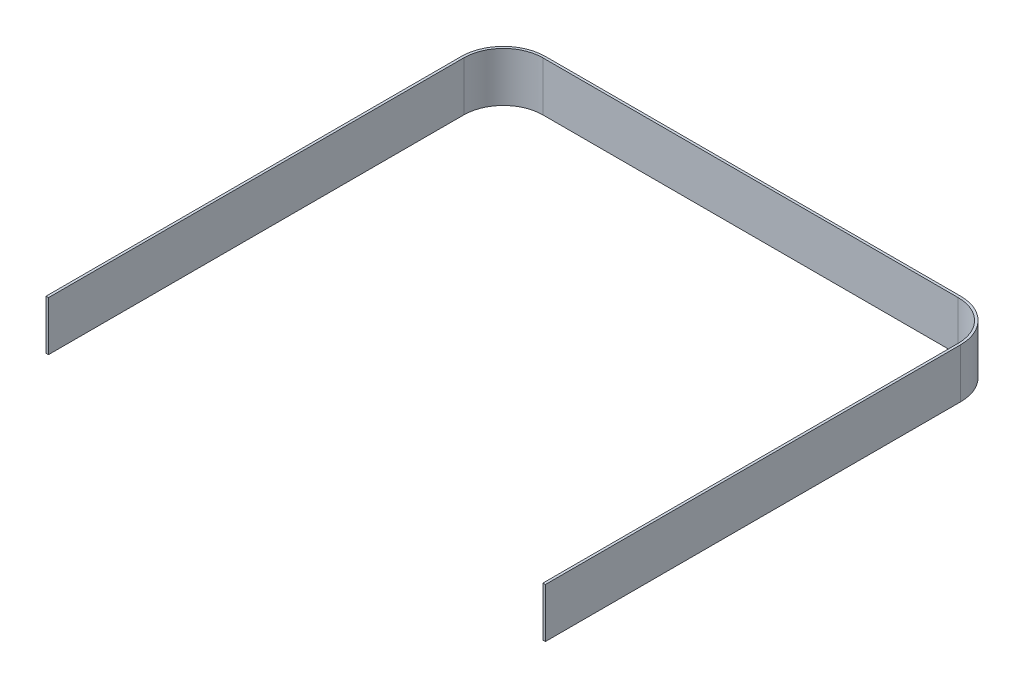
ISO-10303-21;
HEADER;
FILE_DESCRIPTION(('STEP AP214'),'2;1');
FILE_NAME('part.step','',(''),(''),'','','');
FILE_SCHEMA(('AUTOMOTIVE_DESIGN { 1 0 10303 214 1 1 1 1 }'));
ENDSEC;
DATA;
#1=APPLICATION_CONTEXT('core data for automotive mechanical design processes');
#2=APPLICATION_PROTOCOL_DEFINITION('international standard','automotive_design',2000,#1);
#3=PRODUCT_CONTEXT('',#1,'mechanical');
#4=PRODUCT('Part','Part','',(#3));
#5=PRODUCT_RELATED_PRODUCT_CATEGORY('part','',(#4));
#6=PRODUCT_DEFINITION_FORMATION('','',#4);
#7=PRODUCT_DEFINITION_CONTEXT('part definition',#1,'design');
#8=PRODUCT_DEFINITION('design','',#6,#7);
#9=PRODUCT_DEFINITION_SHAPE('','',#8);
#10=(LENGTH_UNIT() NAMED_UNIT(*) SI_UNIT(.MILLI.,.METRE.));
#11=(NAMED_UNIT(*) PLANE_ANGLE_UNIT() SI_UNIT($,.RADIAN.));
#12=(NAMED_UNIT(*) SI_UNIT($,.STERADIAN.) SOLID_ANGLE_UNIT());
#13=UNCERTAINTY_MEASURE_WITH_UNIT(LENGTH_MEASURE(1.E-05),#10,'distance_accuracy_value','');
#14=(GEOMETRIC_REPRESENTATION_CONTEXT(3) GLOBAL_UNCERTAINTY_ASSIGNED_CONTEXT((#13)) GLOBAL_UNIT_ASSIGNED_CONTEXT((#10,
#11,#12)) REPRESENTATION_CONTEXT('',''));
#15=CARTESIAN_POINT('',(0.,0.,0.));
#16=DIRECTION('',(0.,0.,1.));
#17=DIRECTION('',(1.,0.,0.));
#18=AXIS2_PLACEMENT_3D('',#15,#16,#17);
#19=CARTESIAN_POINT('',(-3.175,63.5,50.8));
#20=DIRECTION('',(1.,0.,0.));
#21=DIRECTION('',(0.,0.,-1.));
#22=AXIS2_PLACEMENT_3D('',#19,#20,#21);
#23=PLANE('',#22);
#24=DIRECTION('',(0.,0.,-1.));
#25=VECTOR('',#24,1.);
#26=CARTESIAN_POINT('',(-3.175,0.,50.8));
#27=LINE('',#26,#25);
#28=CARTESIAN_POINT('',(-3.175,0.,50.8));
#29=VERTEX_POINT('',#28);
#30=CARTESIAN_POINT('',(-3.175,0.,584.2));
#31=VERTEX_POINT('',#30);
#32=EDGE_CURVE('E153',#29,#31,#27,.F.);
#33=ORIENTED_EDGE('',*,*,#32,.T.);
#34=DIRECTION('',(0.,-1.,0.));
#35=VECTOR('',#34,1.);
#36=CARTESIAN_POINT('',(-3.175,63.5,584.2));
#37=LINE('',#36,#35);
#38=CARTESIAN_POINT('',(-3.175,63.5,584.2));
#39=VERTEX_POINT('',#38);
#40=EDGE_CURVE('E11',#39,#31,#37,.T.);
#41=ORIENTED_EDGE('',*,*,#40,.F.);
#42=DIRECTION('',(0.,0.,-1.));
#43=VECTOR('',#42,1.);
#44=CARTESIAN_POINT('',(-3.175,63.5,50.8));
#45=LINE('',#44,#43);
#46=CARTESIAN_POINT('',(-3.175,63.5,50.8));
#47=VERTEX_POINT('',#46);
#48=EDGE_CURVE('E101',#47,#39,#45,.F.);
#49=ORIENTED_EDGE('',*,*,#48,.F.);
#50=DIRECTION('',(0.,-1.,0.));
#51=VECTOR('',#50,1.);
#52=CARTESIAN_POINT('',(-3.175,63.5,50.8));
#53=LINE('',#52,#51);
#54=EDGE_CURVE('E149',#47,#29,#53,.T.);
#55=ORIENTED_EDGE('',*,*,#54,.T.);
#56=EDGE_LOOP('',(#33,#41,#49,#55));
#57=FACE_BOUND('',#56,.T.);
#58=ADVANCED_FACE('F33',(#57),#23,.F.);
#59=CARTESIAN_POINT('',(0.,63.5,584.2));
#60=DIRECTION('',(0.,0.,1.));
#61=DIRECTION('',(1.,0.,0.));
#62=AXIS2_PLACEMENT_3D('',#59,#60,#61);
#63=PLANE('',#62);
#64=DIRECTION('',(-1.,0.,0.));
#65=VECTOR('',#64,1.);
#66=CARTESIAN_POINT('',(0.,0.,584.2));
#67=LINE('',#66,#65);
#68=CARTESIAN_POINT('',(0.,0.,584.2));
#69=VERTEX_POINT('',#68);
#70=EDGE_CURVE('E156',#69,#31,#67,.T.);
#71=ORIENTED_EDGE('',*,*,#70,.F.);
#72=DIRECTION('',(0.,-1.,0.));
#73=VECTOR('',#72,1.);
#74=CARTESIAN_POINT('',(0.,63.5,584.2));
#75=LINE('',#74,#73);
#76=CARTESIAN_POINT('',(0.,63.5,584.2));
#77=VERTEX_POINT('',#76);
#78=EDGE_CURVE('E41',#77,#69,#75,.T.);
#79=ORIENTED_EDGE('',*,*,#78,.F.);
#80=DIRECTION('',(-1.,0.,0.));
#81=VECTOR('',#80,1.);
#82=CARTESIAN_POINT('',(0.,63.5,584.2));
#83=LINE('',#82,#81);
#84=EDGE_CURVE('E218',#77,#39,#83,.T.);
#85=ORIENTED_EDGE('',*,*,#84,.T.);
#86=ORIENTED_EDGE('',*,*,#40,.T.);
#87=EDGE_LOOP('',(#71,#79,#85,#86));
#88=FACE_BOUND('',#87,.T.);
#89=ADVANCED_FACE('F205',(#88),#63,.T.);
#90=CARTESIAN_POINT('',(0.,63.5,50.8));
#91=DIRECTION('',(1.,0.,0.));
#92=DIRECTION('',(0.,0.,-1.));
#93=AXIS2_PLACEMENT_3D('',#90,#91,#92);
#94=PLANE('',#93);
#95=DIRECTION('',(0.,0.,1.));
#96=VECTOR('',#95,1.);
#97=CARTESIAN_POINT('',(0.,0.,50.8));
#98=LINE('',#97,#96);
#99=CARTESIAN_POINT('',(0.,0.,50.8));
#100=VERTEX_POINT('',#99);
#101=EDGE_CURVE('E159',#100,#69,#98,.T.);
#102=ORIENTED_EDGE('',*,*,#101,.F.);
#103=DIRECTION('',(0.,-1.,0.));
#104=VECTOR('',#103,1.);
#105=CARTESIAN_POINT('',(0.,63.5,50.8));
#106=LINE('',#105,#104);
#107=CARTESIAN_POINT('',(0.,63.5,50.8));
#108=VERTEX_POINT('',#107);
#109=EDGE_CURVE('E195',#108,#100,#106,.T.);
#110=ORIENTED_EDGE('',*,*,#109,.F.);
#111=DIRECTION('',(0.,0.,1.));
#112=VECTOR('',#111,1.);
#113=CARTESIAN_POINT('',(0.,63.5,50.8));
#114=LINE('',#113,#112);
#115=EDGE_CURVE('E202',#108,#77,#114,.T.);
#116=ORIENTED_EDGE('',*,*,#115,.T.);
#117=ORIENTED_EDGE('',*,*,#78,.T.);
#118=EDGE_LOOP('',(#102,#110,#116,#117));
#119=FACE_BOUND('',#118,.T.);
#120=ADVANCED_FACE('F200',(#119),#94,.T.);
#121=CARTESIAN_POINT('',(50.8,63.5,50.8));
#122=DIRECTION('',(0.,-1.,0.));
#123=DIRECTION('',(0.,0.,-1.));
#124=AXIS2_PLACEMENT_3D('',#121,#122,#123);
#125=CYLINDRICAL_SURFACE('',#124,50.8);
#126=CARTESIAN_POINT('',(50.8,0.,50.8));
#127=DIRECTION('',(0.,1.,0.));
#128=DIRECTION('',(0.,0.,1.));
#129=AXIS2_PLACEMENT_3D('',#126,#127,#128);
#130=CIRCLE('',#129,50.8);
#131=CARTESIAN_POINT('',(50.8,0.,0.));
#132=VERTEX_POINT('',#131);
#133=EDGE_CURVE('E162',#132,#100,#130,.T.);
#134=ORIENTED_EDGE('',*,*,#133,.F.);
#135=DIRECTION('',(0.,-1.,0.));
#136=VECTOR('',#135,1.);
#137=CARTESIAN_POINT('',(50.8,63.5,0.));
#138=LINE('',#137,#136);
#139=CARTESIAN_POINT('',(50.8,63.5,0.));
#140=VERTEX_POINT('',#139);
#141=EDGE_CURVE('E193',#140,#132,#138,.T.);
#142=ORIENTED_EDGE('',*,*,#141,.F.);
#143=CARTESIAN_POINT('',(50.8,63.5,50.8));
#144=DIRECTION('',(0.,1.,0.));
#145=DIRECTION('',(0.,0.,1.));
#146=AXIS2_PLACEMENT_3D('',#143,#144,#145);
#147=CIRCLE('',#146,50.8);
#148=EDGE_CURVE('E215',#140,#108,#147,.T.);
#149=ORIENTED_EDGE('',*,*,#148,.T.);
#150=ORIENTED_EDGE('',*,*,#109,.T.);
#151=EDGE_LOOP('',(#134,#142,#149,#150));
#152=FACE_BOUND('',#151,.T.);
#153=ADVANCED_FACE('F212',(#152),#125,.F.);
#154=CARTESIAN_POINT('',(50.8,63.5,0.));
#155=DIRECTION('',(0.,0.,1.));
#156=DIRECTION('',(1.,0.,0.));
#157=AXIS2_PLACEMENT_3D('',#154,#155,#156);
#158=PLANE('',#157);
#159=DIRECTION('',(-1.,0.,0.));
#160=VECTOR('',#159,1.);
#161=CARTESIAN_POINT('',(50.8,0.,0.));
#162=LINE('',#161,#160);
#163=CARTESIAN_POINT('',(584.2,0.,0.));
#164=VERTEX_POINT('',#163);
#165=EDGE_CURVE('E165',#164,#132,#162,.T.);
#166=ORIENTED_EDGE('',*,*,#165,.F.);
#167=DIRECTION('',(0.,-1.,0.));
#168=VECTOR('',#167,1.);
#169=CARTESIAN_POINT('',(584.2,63.5,0.));
#170=LINE('',#169,#168);
#171=CARTESIAN_POINT('',(584.2,63.5,0.));
#172=VERTEX_POINT('',#171);
#173=EDGE_CURVE('E191',#172,#164,#170,.T.);
#174=ORIENTED_EDGE('',*,*,#173,.F.);
#175=DIRECTION('',(-1.,0.,0.));
#176=VECTOR('',#175,1.);
#177=CARTESIAN_POINT('',(50.8,63.5,0.));
#178=LINE('',#177,#176);
#179=EDGE_CURVE('E220',#172,#140,#178,.T.);
#180=ORIENTED_EDGE('',*,*,#179,.T.);
#181=ORIENTED_EDGE('',*,*,#141,.T.);
#182=EDGE_LOOP('',(#166,#174,#180,#181));
#183=FACE_BOUND('',#182,.T.);
#184=ADVANCED_FACE('F320',(#183),#158,.T.);
#185=CARTESIAN_POINT('',(584.2,63.5,50.8));
#186=DIRECTION('',(0.,-1.,0.));
#187=DIRECTION('',(0.,0.,-1.));
#188=AXIS2_PLACEMENT_3D('',#185,#186,#187);
#189=CYLINDRICAL_SURFACE('',#188,50.8);
#190=CARTESIAN_POINT('',(584.2,0.,50.8));
#191=DIRECTION('',(0.,1.,0.));
#192=DIRECTION('',(0.,0.,-1.));
#193=AXIS2_PLACEMENT_3D('',#190,#191,#192);
#194=CIRCLE('',#193,50.8);
#195=CARTESIAN_POINT('',(635.,0.,50.8));
#196=VERTEX_POINT('',#195);
#197=EDGE_CURVE('E168',#196,#164,#194,.T.);
#198=ORIENTED_EDGE('',*,*,#197,.F.);
#199=DIRECTION('',(0.,-1.,0.));
#200=VECTOR('',#199,1.);
#201=CARTESIAN_POINT('',(635.,63.5,50.8));
#202=LINE('',#201,#200);
#203=CARTESIAN_POINT('',(635.,63.5,50.8));
#204=VERTEX_POINT('',#203);
#205=EDGE_CURVE('E189',#204,#196,#202,.T.);
#206=ORIENTED_EDGE('',*,*,#205,.F.);
#207=CARTESIAN_POINT('',(584.2,63.5,50.8));
#208=DIRECTION('',(0.,1.,0.));
#209=DIRECTION('',(0.,0.,-1.));
#210=AXIS2_PLACEMENT_3D('',#207,#208,#209);
#211=CIRCLE('',#210,50.8);
#212=EDGE_CURVE('E226',#204,#172,#211,.T.);
#213=ORIENTED_EDGE('',*,*,#212,.T.);
#214=ORIENTED_EDGE('',*,*,#173,.T.);
#215=EDGE_LOOP('',(#198,#206,#213,#214));
#216=FACE_BOUND('',#215,.T.);
#217=ADVANCED_FACE('F311',(#216),#189,.F.);
#218=CARTESIAN_POINT('',(635.,63.5,50.8));
#219=DIRECTION('',(-1.,0.,0.));
#220=DIRECTION('',(0.,0.,1.));
#221=AXIS2_PLACEMENT_3D('',#218,#219,#220);
#222=PLANE('',#221);
#223=DIRECTION('',(0.,0.,-1.));
#224=VECTOR('',#223,1.);
#225=CARTESIAN_POINT('',(635.,0.,50.8));
#226=LINE('',#225,#224);
#227=CARTESIAN_POINT('',(635.,0.,584.2));
#228=VERTEX_POINT('',#227);
#229=EDGE_CURVE('E171',#228,#196,#226,.T.);
#230=ORIENTED_EDGE('',*,*,#229,.F.);
#231=DIRECTION('',(0.,-1.,0.));
#232=VECTOR('',#231,1.);
#233=CARTESIAN_POINT('',(635.,63.5,584.2));
#234=LINE('',#233,#232);
#235=CARTESIAN_POINT('',(635.,63.5,584.2));
#236=VERTEX_POINT('',#235);
#237=EDGE_CURVE('E187',#236,#228,#234,.T.);
#238=ORIENTED_EDGE('',*,*,#237,.F.);
#239=DIRECTION('',(0.,0.,-1.));
#240=VECTOR('',#239,1.);
#241=CARTESIAN_POINT('',(635.,63.5,50.8));
#242=LINE('',#241,#240);
#243=EDGE_CURVE('E229',#236,#204,#242,.T.);
#244=ORIENTED_EDGE('',*,*,#243,.T.);
#245=ORIENTED_EDGE('',*,*,#205,.T.);
#246=EDGE_LOOP('',(#230,#238,#244,#245));
#247=FACE_BOUND('',#246,.T.);
#248=ADVANCED_FACE('F241',(#247),#222,.T.);
#249=CARTESIAN_POINT('',(638.175,63.5,584.2));
#250=DIRECTION('',(0.,0.,1.));
#251=DIRECTION('',(1.,0.,0.));
#252=AXIS2_PLACEMENT_3D('',#249,#250,#251);
#253=PLANE('',#252);
#254=DIRECTION('',(-1.,0.,0.));
#255=VECTOR('',#254,1.);
#256=CARTESIAN_POINT('',(638.175,0.,584.2));
#257=LINE('',#256,#255);
#258=CARTESIAN_POINT('',(638.175,0.,584.2));
#259=VERTEX_POINT('',#258);
#260=EDGE_CURVE('E174',#259,#228,#257,.T.);
#261=ORIENTED_EDGE('',*,*,#260,.F.);
#262=DIRECTION('',(0.,-1.,0.));
#263=VECTOR('',#262,1.);
#264=CARTESIAN_POINT('',(638.175,63.5,584.2));
#265=LINE('',#264,#263);
#266=CARTESIAN_POINT('',(638.175,63.5,584.2));
#267=VERTEX_POINT('',#266);
#268=EDGE_CURVE('E185',#267,#259,#265,.T.);
#269=ORIENTED_EDGE('',*,*,#268,.F.);
#270=DIRECTION('',(-1.,0.,0.));
#271=VECTOR('',#270,1.);
#272=CARTESIAN_POINT('',(638.175,63.5,584.2));
#273=LINE('',#272,#271);
#274=EDGE_CURVE('E232',#267,#236,#273,.T.);
#275=ORIENTED_EDGE('',*,*,#274,.T.);
#276=ORIENTED_EDGE('',*,*,#237,.T.);
#277=EDGE_LOOP('',(#261,#269,#275,#276));
#278=FACE_BOUND('',#277,.T.);
#279=ADVANCED_FACE('F236',(#278),#253,.T.);
#280=CARTESIAN_POINT('',(638.175,63.5,50.8));
#281=DIRECTION('',(-1.,0.,0.));
#282=DIRECTION('',(0.,0.,1.));
#283=AXIS2_PLACEMENT_3D('',#280,#281,#282);
#284=PLANE('',#283);
#285=DIRECTION('',(0.,0.,-1.));
#286=VECTOR('',#285,1.);
#287=CARTESIAN_POINT('',(638.175,0.,50.8));
#288=LINE('',#287,#286);
#289=CARTESIAN_POINT('',(638.175,0.,50.8));
#290=VERTEX_POINT('',#289);
#291=EDGE_CURVE('E177',#259,#290,#288,.T.);
#292=ORIENTED_EDGE('',*,*,#291,.T.);
#293=DIRECTION('',(0.,-1.,0.));
#294=VECTOR('',#293,1.);
#295=CARTESIAN_POINT('',(638.175,63.5,50.8));
#296=LINE('',#295,#294);
#297=CARTESIAN_POINT('',(638.175,63.5,50.8));
#298=VERTEX_POINT('',#297);
#299=EDGE_CURVE('E144',#298,#290,#296,.T.);
#300=ORIENTED_EDGE('',*,*,#299,.F.);
#301=DIRECTION('',(0.,0.,-1.));
#302=VECTOR('',#301,1.);
#303=CARTESIAN_POINT('',(638.175,63.5,50.8));
#304=LINE('',#303,#302);
#305=EDGE_CURVE('E135',#267,#298,#304,.T.);
#306=ORIENTED_EDGE('',*,*,#305,.F.);
#307=ORIENTED_EDGE('',*,*,#268,.T.);
#308=EDGE_LOOP('',(#292,#300,#306,#307));
#309=FACE_BOUND('',#308,.T.);
#310=ADVANCED_FACE('F245',(#309),#284,.F.);
#311=CARTESIAN_POINT('',(584.2,63.5,50.8));
#312=DIRECTION('',(0.,-1.,0.));
#313=DIRECTION('',(0.,0.,-1.));
#314=AXIS2_PLACEMENT_3D('',#311,#312,#313);
#315=CYLINDRICAL_SURFACE('',#314,53.975);
#316=CARTESIAN_POINT('',(584.2,0.,50.8));
#317=DIRECTION('',(0.,1.,0.));
#318=DIRECTION('',(1.,0.,0.));
#319=AXIS2_PLACEMENT_3D('',#316,#317,#318);
#320=CIRCLE('',#319,53.975);
#321=CARTESIAN_POINT('',(584.2,0.,-3.175));
#322=VERTEX_POINT('',#321);
#323=EDGE_CURVE('E143',#290,#322,#320,.T.);
#324=ORIENTED_EDGE('',*,*,#323,.T.);
#325=DIRECTION('',(0.,-1.,0.));
#326=VECTOR('',#325,1.);
#327=CARTESIAN_POINT('',(584.2,63.5,-3.175));
#328=LINE('',#327,#326);
#329=CARTESIAN_POINT('',(584.2,63.5,-3.175));
#330=VERTEX_POINT('',#329);
#331=EDGE_CURVE('E140',#330,#322,#328,.T.);
#332=ORIENTED_EDGE('',*,*,#331,.F.);
#333=CARTESIAN_POINT('',(584.2,63.5,50.8));
#334=DIRECTION('',(0.,1.,0.));
#335=DIRECTION('',(1.,0.,0.));
#336=AXIS2_PLACEMENT_3D('',#333,#334,#335);
#337=CIRCLE('',#336,53.975);
#338=EDGE_CURVE('E128',#298,#330,#337,.T.);
#339=ORIENTED_EDGE('',*,*,#338,.F.);
#340=ORIENTED_EDGE('',*,*,#299,.T.);
#341=EDGE_LOOP('',(#324,#332,#339,#340));
#342=FACE_BOUND('',#341,.T.);
#343=ADVANCED_FACE('F141',(#342),#315,.T.);
#344=CARTESIAN_POINT('',(50.8,63.5,-3.175));
#345=DIRECTION('',(0.,0.,1.));
#346=DIRECTION('',(1.,0.,0.));
#347=AXIS2_PLACEMENT_3D('',#344,#345,#346);
#348=PLANE('',#347);
#349=DIRECTION('',(1.,0.,0.));
#350=VECTOR('',#349,1.);
#351=CARTESIAN_POINT('',(50.8,0.,-3.175));
#352=LINE('',#351,#350);
#353=CARTESIAN_POINT('',(50.8,0.,-3.17499999999999));
#354=VERTEX_POINT('',#353);
#355=EDGE_CURVE('E89',#322,#354,#352,.F.);
#356=ORIENTED_EDGE('',*,*,#355,.T.);
#357=DIRECTION('',(0.,-1.,0.));
#358=VECTOR('',#357,1.);
#359=CARTESIAN_POINT('',(50.8,63.5,-3.17499999999999));
#360=LINE('',#359,#358);
#361=CARTESIAN_POINT('',(50.8,63.5,-3.17499999999999));
#362=VERTEX_POINT('',#361);
#363=EDGE_CURVE('E145',#362,#354,#360,.T.);
#364=ORIENTED_EDGE('',*,*,#363,.F.);
#365=DIRECTION('',(1.,0.,0.));
#366=VECTOR('',#365,1.);
#367=CARTESIAN_POINT('',(50.8,63.5,-3.175));
#368=LINE('',#367,#366);
#369=EDGE_CURVE('E132',#330,#362,#368,.F.);
#370=ORIENTED_EDGE('',*,*,#369,.F.);
#371=ORIENTED_EDGE('',*,*,#331,.T.);
#372=EDGE_LOOP('',(#356,#364,#370,#371));
#373=FACE_BOUND('',#372,.T.);
#374=ADVANCED_FACE('F147',(#373),#348,.F.);
#375=CARTESIAN_POINT('',(50.8,63.5,50.8));
#376=DIRECTION('',(0.,-1.,0.));
#377=DIRECTION('',(0.,0.,-1.));
#378=AXIS2_PLACEMENT_3D('',#375,#376,#377);
#379=CYLINDRICAL_SURFACE('',#378,53.975);
#380=CARTESIAN_POINT('',(50.8,0.,50.8));
#381=DIRECTION('',(0.,1.,0.));
#382=DIRECTION('',(1.,0.,0.));
#383=AXIS2_PLACEMENT_3D('',#380,#381,#382);
#384=CIRCLE('',#383,53.975);
#385=EDGE_CURVE('E95',#354,#29,#384,.T.);
#386=ORIENTED_EDGE('',*,*,#385,.T.);
#387=ORIENTED_EDGE('',*,*,#54,.F.);
#388=CARTESIAN_POINT('',(50.8,63.5,50.8));
#389=DIRECTION('',(0.,1.,0.));
#390=DIRECTION('',(1.,0.,0.));
#391=AXIS2_PLACEMENT_3D('',#388,#389,#390);
#392=CIRCLE('',#391,53.975);
#393=EDGE_CURVE('E49',#362,#47,#392,.T.);
#394=ORIENTED_EDGE('',*,*,#393,.F.);
#395=ORIENTED_EDGE('',*,*,#363,.T.);
#396=EDGE_LOOP('',(#386,#387,#394,#395));
#397=FACE_BOUND('',#396,.T.);
#398=ADVANCED_FACE('F259',(#397),#379,.T.);
#399=CARTESIAN_POINT('',(50.8,63.5,50.8));
#400=DIRECTION('',(0.,1.,0.));
#401=DIRECTION('',(1.,0.,0.));
#402=AXIS2_PLACEMENT_3D('',#399,#400,#401);
#403=PLANE('',#402);
#404=ORIENTED_EDGE('',*,*,#48,.T.);
#405=ORIENTED_EDGE('',*,*,#84,.F.);
#406=ORIENTED_EDGE('',*,*,#115,.F.);
#407=ORIENTED_EDGE('',*,*,#148,.F.);
#408=ORIENTED_EDGE('',*,*,#179,.F.);
#409=ORIENTED_EDGE('',*,*,#212,.F.);
#410=ORIENTED_EDGE('',*,*,#243,.F.);
#411=ORIENTED_EDGE('',*,*,#274,.F.);
#412=ORIENTED_EDGE('',*,*,#305,.T.);
#413=ORIENTED_EDGE('',*,*,#338,.T.);
#414=ORIENTED_EDGE('',*,*,#369,.T.);
#415=ORIENTED_EDGE('',*,*,#393,.T.);
#416=EDGE_LOOP('',(#404,#405,#406,#407,#408,#409,#410,#411,#412,#413,#414,#415));
#417=FACE_BOUND('',#416,.T.);
#418=ADVANCED_FACE('F130',(#417),#403,.T.);
#419=CARTESIAN_POINT('',(50.8,0.,50.8));
#420=DIRECTION('',(0.,1.,0.));
#421=DIRECTION('',(1.,0.,0.));
#422=AXIS2_PLACEMENT_3D('',#419,#420,#421);
#423=PLANE('',#422);
#424=ORIENTED_EDGE('',*,*,#32,.F.);
#425=ORIENTED_EDGE('',*,*,#385,.F.);
#426=ORIENTED_EDGE('',*,*,#355,.F.);
#427=ORIENTED_EDGE('',*,*,#323,.F.);
#428=ORIENTED_EDGE('',*,*,#291,.F.);
#429=ORIENTED_EDGE('',*,*,#260,.T.);
#430=ORIENTED_EDGE('',*,*,#229,.T.);
#431=ORIENTED_EDGE('',*,*,#197,.T.);
#432=ORIENTED_EDGE('',*,*,#165,.T.);
#433=ORIENTED_EDGE('',*,*,#133,.T.);
#434=ORIENTED_EDGE('',*,*,#101,.T.);
#435=ORIENTED_EDGE('',*,*,#70,.T.);
#436=EDGE_LOOP('',(#424,#425,#426,#427,#428,#429,#430,#431,#432,#433,#434,#435));
#437=FACE_BOUND('',#436,.T.);
#438=ADVANCED_FACE('F208',(#437),#423,.F.);
#439=CLOSED_SHELL('',(#58,#89,#120,#153,#184,#217,#248,#279,#310,#343,#374,#398,#418,#438));
#440=MANIFOLD_SOLID_BREP('B2',#439);
#441=ADVANCED_BREP_SHAPE_REPRESENTATION('',(#18,#440),#14);
#442=SHAPE_DEFINITION_REPRESENTATION(#9,#441);
ENDSEC;
END-ISO-10303-21;
